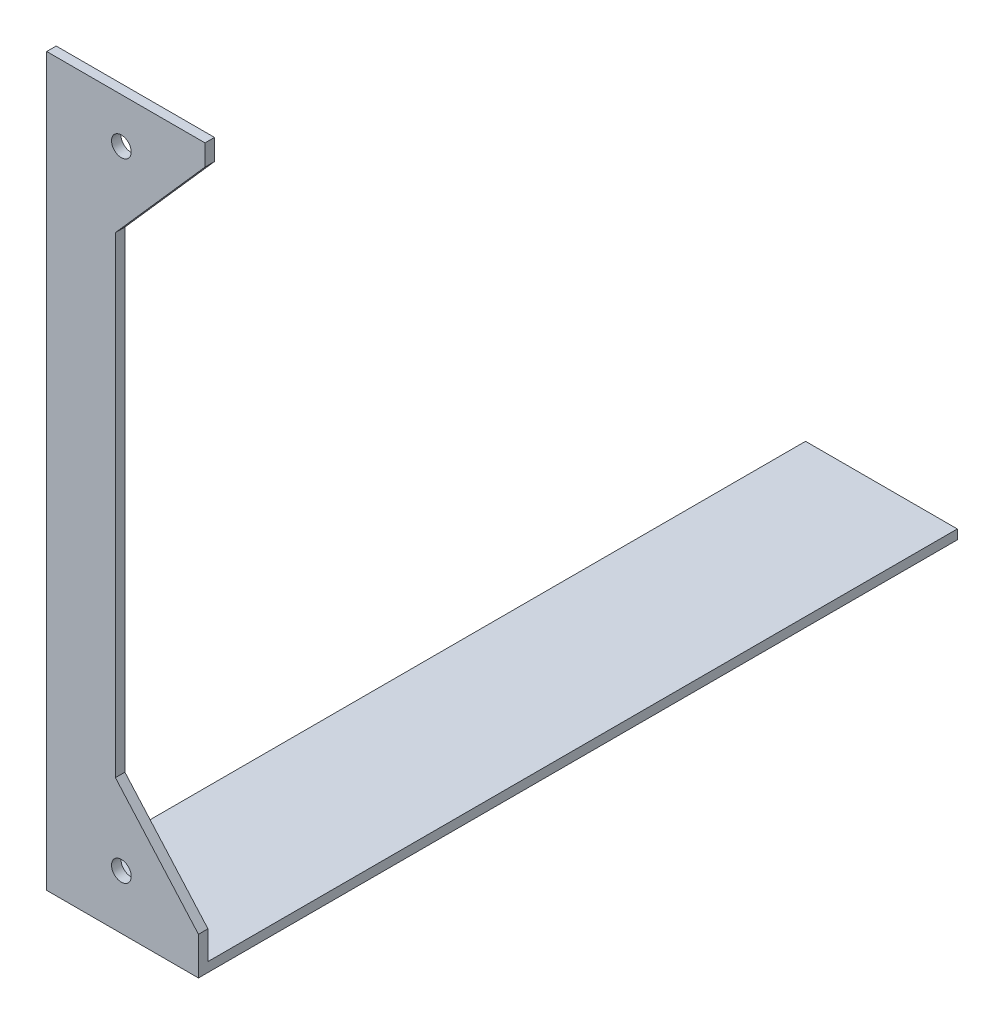
ISO-10303-21;
HEADER;
FILE_DESCRIPTION(('STEP AP214'),'2;1');
FILE_NAME('part.step','',(''),(''),'','','');
FILE_SCHEMA(('AUTOMOTIVE_DESIGN { 1 0 10303 214 1 1 1 1 }'));
ENDSEC;
DATA;
#1=APPLICATION_CONTEXT('core data for automotive mechanical design processes');
#2=APPLICATION_PROTOCOL_DEFINITION('international standard','automotive_design',2000,#1);
#3=PRODUCT_CONTEXT('',#1,'mechanical');
#4=PRODUCT('Part','Part','',(#3));
#5=PRODUCT_RELATED_PRODUCT_CATEGORY('part','',(#4));
#6=PRODUCT_DEFINITION_FORMATION('','',#4);
#7=PRODUCT_DEFINITION_CONTEXT('part definition',#1,'design');
#8=PRODUCT_DEFINITION('design','',#6,#7);
#9=PRODUCT_DEFINITION_SHAPE('','',#8);
#10=(LENGTH_UNIT() NAMED_UNIT(*) SI_UNIT(.MILLI.,.METRE.));
#11=(NAMED_UNIT(*) PLANE_ANGLE_UNIT() SI_UNIT($,.RADIAN.));
#12=(NAMED_UNIT(*) SI_UNIT($,.STERADIAN.) SOLID_ANGLE_UNIT());
#13=UNCERTAINTY_MEASURE_WITH_UNIT(LENGTH_MEASURE(1.E-05),#10,'distance_accuracy_value','');
#14=(GEOMETRIC_REPRESENTATION_CONTEXT(3) GLOBAL_UNCERTAINTY_ASSIGNED_CONTEXT((#13)) GLOBAL_UNIT_ASSIGNED_CONTEXT((#10,
#11,#12)) REPRESENTATION_CONTEXT('',''));
#15=CARTESIAN_POINT('',(0.,0.,0.));
#16=DIRECTION('',(0.,0.,1.));
#17=DIRECTION('',(1.,0.,0.));
#18=AXIS2_PLACEMENT_3D('',#15,#16,#17);
#19=CARTESIAN_POINT('',(-238.5,0.,1.5875));
#20=DIRECTION('',(-1.,0.,0.));
#21=DIRECTION('',(0.,0.,1.));
#22=AXIS2_PLACEMENT_3D('',#19,#20,#21);
#23=PLANE('',#22);
#24=DIRECTION('',(0.,1.,0.));
#25=VECTOR('',#24,1.);
#26=CARTESIAN_POINT('',(-238.5,0.,0.));
#27=LINE('',#26,#25);
#28=CARTESIAN_POINT('',(-238.5,20.5,0.));
#29=VERTEX_POINT('',#28);
#30=CARTESIAN_POINT('',(-238.5,99.5,0.));
#31=VERTEX_POINT('',#30);
#32=EDGE_CURVE('E147',#29,#31,#27,.T.);
#33=ORIENTED_EDGE('',*,*,#32,.T.);
#34=DIRECTION('',(0.,0.,-1.));
#35=VECTOR('',#34,1.);
#36=CARTESIAN_POINT('',(-238.5,99.5,1.5875));
#37=LINE('',#36,#35);
#38=CARTESIAN_POINT('',(-238.5,99.5,1.5875));
#39=VERTEX_POINT('',#38);
#40=EDGE_CURVE('E11',#39,#31,#37,.T.);
#41=ORIENTED_EDGE('',*,*,#40,.F.);
#42=DIRECTION('',(0.,1.,0.));
#43=VECTOR('',#42,1.);
#44=CARTESIAN_POINT('',(-238.5,0.,1.5875));
#45=LINE('',#44,#43);
#46=CARTESIAN_POINT('',(-238.5,20.5,1.5875));
#47=VERTEX_POINT('',#46);
#48=EDGE_CURVE('E172',#47,#39,#45,.T.);
#49=ORIENTED_EDGE('',*,*,#48,.F.);
#50=DIRECTION('',(0.,0.,-1.));
#51=VECTOR('',#50,1.);
#52=CARTESIAN_POINT('',(-238.5,20.5,1.5875));
#53=LINE('',#52,#51);
#54=EDGE_CURVE('E146',#47,#29,#53,.T.);
#55=ORIENTED_EDGE('',*,*,#54,.T.);
#56=EDGE_LOOP('',(#33,#41,#49,#55));
#57=FACE_BOUND('',#56,.T.);
#58=ADVANCED_FACE('F41',(#57),#23,.F.);
#59=CARTESIAN_POINT('',(-183.461089494164,161.877431906615,1.5875));
#60=DIRECTION('',(-0.749837855365093,0.661621637086846,0.));
#61=DIRECTION('',(-0.661621637086846,-0.749837855365093,0.));
#62=AXIS2_PLACEMENT_3D('',#59,#60,#61);
#63=PLANE('',#62);
#64=DIRECTION('',(0.661621637086846,0.749837855365093,0.));
#65=VECTOR('',#64,1.);
#66=CARTESIAN_POINT('',(-183.461089494164,161.877431906615,0.));
#67=LINE('',#66,#65);
#68=CARTESIAN_POINT('',(-223.5,116.5,0.));
#69=VERTEX_POINT('',#68);
#70=EDGE_CURVE('E150',#31,#69,#67,.T.);
#71=ORIENTED_EDGE('',*,*,#70,.T.);
#72=DIRECTION('',(0.,0.,-1.));
#73=VECTOR('',#72,1.);
#74=CARTESIAN_POINT('',(-223.5,116.5,1.5875));
#75=LINE('',#74,#73);
#76=CARTESIAN_POINT('',(-223.5,116.5,1.5875));
#77=VERTEX_POINT('',#76);
#78=EDGE_CURVE('E49',#77,#69,#75,.T.);
#79=ORIENTED_EDGE('',*,*,#78,.F.);
#80=DIRECTION('',(0.661621637086846,0.749837855365093,0.));
#81=VECTOR('',#80,1.);
#82=CARTESIAN_POINT('',(-183.461089494164,161.877431906615,1.5875));
#83=LINE('',#82,#81);
#84=EDGE_CURVE('E94',#39,#77,#83,.T.);
#85=ORIENTED_EDGE('',*,*,#84,.F.);
#86=ORIENTED_EDGE('',*,*,#40,.T.);
#87=EDGE_LOOP('',(#71,#79,#85,#86));
#88=FACE_BOUND('',#87,.T.);
#89=ADVANCED_FACE('F219',(#88),#63,.F.);
#90=CARTESIAN_POINT('',(-223.500000000002,3.54478351433893E-12,1.5875));
#91=DIRECTION('',(-1.,0.,0.));
#92=DIRECTION('',(0.,-1.,0.));
#93=AXIS2_PLACEMENT_3D('',#90,#91,#92);
#94=PLANE('',#93);
#95=DIRECTION('',(0.,1.,0.));
#96=VECTOR('',#95,1.);
#97=CARTESIAN_POINT('',(-223.500000000002,3.54478351433893E-12,0.));
#98=LINE('',#97,#96);
#99=CARTESIAN_POINT('',(-223.5,120.,0.));
#100=VERTEX_POINT('',#99);
#101=EDGE_CURVE('E153',#69,#100,#98,.T.);
#102=ORIENTED_EDGE('',*,*,#101,.T.);
#103=DIRECTION('',(0.,0.,-1.));
#104=VECTOR('',#103,1.);
#105=CARTESIAN_POINT('',(-223.5,120.,1.5875));
#106=LINE('',#105,#104);
#107=CARTESIAN_POINT('',(-223.5,120.,1.5875));
#108=VERTEX_POINT('',#107);
#109=EDGE_CURVE('E115',#108,#100,#106,.T.);
#110=ORIENTED_EDGE('',*,*,#109,.F.);
#111=DIRECTION('',(0.,1.,0.));
#112=VECTOR('',#111,1.);
#113=CARTESIAN_POINT('',(-223.500000000002,3.54478351433893E-12,1.5875));
#114=LINE('',#113,#112);
#115=EDGE_CURVE('E125',#77,#108,#114,.T.);
#116=ORIENTED_EDGE('',*,*,#115,.F.);
#117=ORIENTED_EDGE('',*,*,#78,.T.);
#118=EDGE_LOOP('',(#102,#110,#116,#117));
#119=FACE_BOUND('',#118,.T.);
#120=ADVANCED_FACE('F178',(#119),#94,.F.);
#121=CARTESIAN_POINT('',(0.,120.,1.5875));
#122=DIRECTION('',(0.,1.,0.));
#123=DIRECTION('',(0.,0.,1.));
#124=AXIS2_PLACEMENT_3D('',#121,#122,#123);
#125=PLANE('',#124);
#126=DIRECTION('',(1.,0.,0.));
#127=VECTOR('',#126,1.);
#128=CARTESIAN_POINT('',(0.,120.,0.));
#129=LINE('',#128,#127);
#130=CARTESIAN_POINT('',(-250.,120.,0.));
#131=VERTEX_POINT('',#130);
#132=EDGE_CURVE('E110',#131,#100,#129,.T.);
#133=ORIENTED_EDGE('',*,*,#132,.F.);
#134=DIRECTION('',(0.,0.,-1.));
#135=VECTOR('',#134,1.);
#136=CARTESIAN_POINT('',(-250.,120.,1.5875));
#137=LINE('',#136,#135);
#138=CARTESIAN_POINT('',(-250.,120.,1.5875));
#139=VERTEX_POINT('',#138);
#140=EDGE_CURVE('E105',#139,#131,#137,.T.);
#141=ORIENTED_EDGE('',*,*,#140,.F.);
#142=DIRECTION('',(1.,0.,0.));
#143=VECTOR('',#142,1.);
#144=CARTESIAN_POINT('',(0.,120.,1.5875));
#145=LINE('',#144,#143);
#146=EDGE_CURVE('E108',#139,#108,#145,.T.);
#147=ORIENTED_EDGE('',*,*,#146,.T.);
#148=ORIENTED_EDGE('',*,*,#109,.T.);
#149=EDGE_LOOP('',(#133,#141,#147,#148));
#150=FACE_BOUND('',#149,.T.);
#151=ADVANCED_FACE('F107',(#150),#125,.T.);
#152=CARTESIAN_POINT('',(-250.,0.,1.5875));
#153=DIRECTION('',(-1.,0.,0.));
#154=DIRECTION('',(0.,0.,1.));
#155=AXIS2_PLACEMENT_3D('',#152,#153,#154);
#156=PLANE('',#155);
#157=DIRECTION('',(0.,1.,0.));
#158=VECTOR('',#157,1.);
#159=CARTESIAN_POINT('',(-250.,0.,0.));
#160=LINE('',#159,#158);
#161=CARTESIAN_POINT('',(-250.,0.,0.));
#162=VERTEX_POINT('',#161);
#163=EDGE_CURVE('E157',#162,#131,#160,.T.);
#164=ORIENTED_EDGE('',*,*,#163,.F.);
#165=DIRECTION('',(0.,0.,-1.));
#166=VECTOR('',#165,1.);
#167=CARTESIAN_POINT('',(-250.,0.,1.5875));
#168=LINE('',#167,#166);
#169=CARTESIAN_POINT('',(-250.,0.,-125.4125));
#170=VERTEX_POINT('',#169);
#171=EDGE_CURVE('E186',#162,#170,#168,.T.);
#172=ORIENTED_EDGE('',*,*,#171,.T.);
#173=DIRECTION('',(0.,1.,0.));
#174=VECTOR('',#173,1.);
#175=CARTESIAN_POINT('',(-250.,-1.5875,-125.4125));
#176=LINE('',#175,#174);
#177=CARTESIAN_POINT('',(-250.,-1.5875,-125.4125));
#178=VERTEX_POINT('',#177);
#179=EDGE_CURVE('E189',#178,#170,#176,.T.);
#180=ORIENTED_EDGE('',*,*,#179,.F.);
#181=DIRECTION('',(0.,0.,-1.));
#182=VECTOR('',#181,1.);
#183=CARTESIAN_POINT('',(-250.,-1.5875,1.5875));
#184=LINE('',#183,#182);
#185=CARTESIAN_POINT('',(-250.,-1.5875,1.5875));
#186=VERTEX_POINT('',#185);
#187=EDGE_CURVE('E132',#186,#178,#184,.T.);
#188=ORIENTED_EDGE('',*,*,#187,.F.);
#189=DIRECTION('',(0.,1.,0.));
#190=VECTOR('',#189,1.);
#191=CARTESIAN_POINT('',(-250.,0.,1.5875));
#192=LINE('',#191,#190);
#193=EDGE_CURVE('E122',#186,#139,#192,.T.);
#194=ORIENTED_EDGE('',*,*,#193,.T.);
#195=ORIENTED_EDGE('',*,*,#140,.T.);
#196=EDGE_LOOP('',(#164,#172,#180,#188,#194,#195));
#197=FACE_BOUND('',#196,.T.);
#198=ADVANCED_FACE('F129',(#197),#156,.T.);
#199=CARTESIAN_POINT('',(-224.6,0.,1.5875));
#200=DIRECTION('',(1.,0.,0.));
#201=DIRECTION('',(0.,0.,-1.));
#202=AXIS2_PLACEMENT_3D('',#199,#200,#201);
#203=PLANE('',#202);
#204=DIRECTION('',(0.,-1.,0.));
#205=VECTOR('',#204,1.);
#206=CARTESIAN_POINT('',(-224.6,0.,0.));
#207=LINE('',#206,#205);
#208=CARTESIAN_POINT('',(-224.6,4.74666666666657,0.));
#209=VERTEX_POINT('',#208);
#210=CARTESIAN_POINT('',(-224.6,0.,0.));
#211=VERTEX_POINT('',#210);
#212=EDGE_CURVE('E162',#209,#211,#207,.T.);
#213=ORIENTED_EDGE('',*,*,#212,.F.);
#214=DIRECTION('',(0.,0.,-1.));
#215=VECTOR('',#214,1.);
#216=CARTESIAN_POINT('',(-224.6,4.74666666666657,1.5875));
#217=LINE('',#216,#215);
#218=CARTESIAN_POINT('',(-224.6,4.74666666666657,1.5875));
#219=VERTEX_POINT('',#218);
#220=EDGE_CURVE('E83',#219,#209,#217,.T.);
#221=ORIENTED_EDGE('',*,*,#220,.F.);
#222=DIRECTION('',(0.,-1.,0.));
#223=VECTOR('',#222,1.);
#224=CARTESIAN_POINT('',(-224.6,0.,1.5875));
#225=LINE('',#224,#223);
#226=CARTESIAN_POINT('',(-224.6,-1.5875,1.5875));
#227=VERTEX_POINT('',#226);
#228=EDGE_CURVE('E133',#219,#227,#225,.T.);
#229=ORIENTED_EDGE('',*,*,#228,.T.);
#230=DIRECTION('',(0.,0.,1.));
#231=VECTOR('',#230,1.);
#232=CARTESIAN_POINT('',(-224.6,-1.5875,-125.4125));
#233=LINE('',#232,#231);
#234=CARTESIAN_POINT('',(-224.6,-1.5875,-125.4125));
#235=VERTEX_POINT('',#234);
#236=EDGE_CURVE('E262',#235,#227,#233,.T.);
#237=ORIENTED_EDGE('',*,*,#236,.F.);
#238=DIRECTION('',(0.,1.,0.));
#239=VECTOR('',#238,1.);
#240=CARTESIAN_POINT('',(-224.6,-1.5875,-125.4125));
#241=LINE('',#240,#239);
#242=CARTESIAN_POINT('',(-224.6,0.,-125.4125));
#243=VERTEX_POINT('',#242);
#244=EDGE_CURVE('E151',#235,#243,#241,.T.);
#245=ORIENTED_EDGE('',*,*,#244,.T.);
#246=DIRECTION('',(0.,0.,1.));
#247=VECTOR('',#246,1.);
#248=CARTESIAN_POINT('',(-224.6,0.,-125.4125));
#249=LINE('',#248,#247);
#250=EDGE_CURVE('E196',#243,#211,#249,.T.);
#251=ORIENTED_EDGE('',*,*,#250,.T.);
#252=EDGE_LOOP('',(#213,#221,#229,#237,#245,#251));
#253=FACE_BOUND('',#252,.T.);
#254=ADVANCED_FACE('F231',(#253),#203,.T.);
#255=CARTESIAN_POINT('',(-237.5,7.5,1.5875));
#256=DIRECTION('',(0.,0.,-1.));
#257=DIRECTION('',(-1.,0.,0.));
#258=AXIS2_PLACEMENT_3D('',#255,#256,#257);
#259=CYLINDRICAL_SURFACE('',#258,1.65);
#260=CARTESIAN_POINT('',(-237.5,7.5,1.5875));
#261=DIRECTION('',(0.,0.,1.));
#262=DIRECTION('',(1.,0.,0.));
#263=AXIS2_PLACEMENT_3D('',#260,#261,#262);
#264=CIRCLE('',#263,1.65);
#265=CARTESIAN_POINT('',(-235.85,7.5,1.5875));
#266=VERTEX_POINT('',#265);
#267=EDGE_CURVE('E140',#266,#266,#264,.T.);
#268=ORIENTED_EDGE('',*,*,#267,.T.);
#269=EDGE_LOOP('',(#268));
#270=FACE_BOUND('',#269,.T.);
#271=CARTESIAN_POINT('',(-237.5,7.5,0.));
#272=DIRECTION('',(0.,0.,1.));
#273=DIRECTION('',(1.,0.,0.));
#274=AXIS2_PLACEMENT_3D('',#271,#272,#273);
#275=CIRCLE('',#274,1.65);
#276=CARTESIAN_POINT('',(-235.85,7.5,0.));
#277=VERTEX_POINT('',#276);
#278=EDGE_CURVE('E166',#277,#277,#275,.T.);
#279=ORIENTED_EDGE('',*,*,#278,.F.);
#280=EDGE_LOOP('',(#279));
#281=FACE_BOUND('',#280,.T.);
#282=ADVANCED_FACE('F234',(#270,#281),#259,.F.);
#283=CARTESIAN_POINT('',(-123.928015564202,-109.348249027237,1.5875));
#284=DIRECTION('',(-0.749837855365093,-0.661621637086846,0.));
#285=DIRECTION('',(0.661621637086846,-0.749837855365093,0.));
#286=AXIS2_PLACEMENT_3D('',#283,#284,#285);
#287=PLANE('',#286);
#288=DIRECTION('',(-0.661621637086846,0.749837855365093,0.));
#289=VECTOR('',#288,1.);
#290=CARTESIAN_POINT('',(-123.928015564202,-109.348249027237,0.));
#291=LINE('',#290,#289);
#292=EDGE_CURVE('E86',#209,#29,#291,.T.);
#293=ORIENTED_EDGE('',*,*,#292,.T.);
#294=ORIENTED_EDGE('',*,*,#54,.F.);
#295=DIRECTION('',(-0.661621637086846,0.749837855365093,0.));
#296=VECTOR('',#295,1.);
#297=CARTESIAN_POINT('',(-123.928015564202,-109.348249027237,1.5875));
#298=LINE('',#297,#296);
#299=EDGE_CURVE('E57',#219,#47,#298,.T.);
#300=ORIENTED_EDGE('',*,*,#299,.F.);
#301=ORIENTED_EDGE('',*,*,#220,.T.);
#302=EDGE_LOOP('',(#293,#294,#300,#301));
#303=FACE_BOUND('',#302,.T.);
#304=ADVANCED_FACE('F236',(#303),#287,.F.);
#305=CARTESIAN_POINT('',(-237.5,112.5,1.5875));
#306=DIRECTION('',(0.,0.,-1.));
#307=DIRECTION('',(-1.,0.,0.));
#308=AXIS2_PLACEMENT_3D('',#305,#306,#307);
#309=CYLINDRICAL_SURFACE('',#308,1.65);
#310=CARTESIAN_POINT('',(-237.5,112.5,1.5875));
#311=DIRECTION('',(0.,0.,1.));
#312=DIRECTION('',(1.,0.,0.));
#313=AXIS2_PLACEMENT_3D('',#310,#311,#312);
#314=CIRCLE('',#313,1.65);
#315=CARTESIAN_POINT('',(-235.85,112.5,1.5875));
#316=VERTEX_POINT('',#315);
#317=EDGE_CURVE('E143',#316,#316,#314,.T.);
#318=ORIENTED_EDGE('',*,*,#317,.T.);
#319=EDGE_LOOP('',(#318));
#320=FACE_BOUND('',#319,.T.);
#321=CARTESIAN_POINT('',(-237.5,112.5,0.));
#322=DIRECTION('',(0.,0.,1.));
#323=DIRECTION('',(1.,0.,0.));
#324=AXIS2_PLACEMENT_3D('',#321,#322,#323);
#325=CIRCLE('',#324,1.65);
#326=CARTESIAN_POINT('',(-235.85,112.5,0.));
#327=VERTEX_POINT('',#326);
#328=EDGE_CURVE('E169',#327,#327,#325,.T.);
#329=ORIENTED_EDGE('',*,*,#328,.F.);
#330=EDGE_LOOP('',(#329));
#331=FACE_BOUND('',#330,.T.);
#332=ADVANCED_FACE('F239',(#320,#331),#309,.F.);
#333=CARTESIAN_POINT('',(0.,0.,1.5875));
#334=DIRECTION('',(0.,0.,1.));
#335=DIRECTION('',(1.,0.,0.));
#336=AXIS2_PLACEMENT_3D('',#333,#334,#335);
#337=PLANE('',#336);
#338=ORIENTED_EDGE('',*,*,#48,.T.);
#339=ORIENTED_EDGE('',*,*,#84,.T.);
#340=ORIENTED_EDGE('',*,*,#115,.T.);
#341=ORIENTED_EDGE('',*,*,#146,.F.);
#342=ORIENTED_EDGE('',*,*,#193,.F.);
#343=DIRECTION('',(-1.,0.,0.));
#344=VECTOR('',#343,1.);
#345=CARTESIAN_POINT('',(-224.6,-1.5875,1.5875));
#346=LINE('',#345,#344);
#347=EDGE_CURVE('E270',#227,#186,#346,.T.);
#348=ORIENTED_EDGE('',*,*,#347,.F.);
#349=ORIENTED_EDGE('',*,*,#228,.F.);
#350=ORIENTED_EDGE('',*,*,#299,.T.);
#351=EDGE_LOOP('',(#338,#339,#340,#341,#342,#348,#349,#350));
#352=FACE_BOUND('',#351,.T.);
#353=ORIENTED_EDGE('',*,*,#267,.F.);
#354=EDGE_LOOP('',(#353));
#355=FACE_BOUND('',#354,.T.);
#356=ORIENTED_EDGE('',*,*,#317,.F.);
#357=EDGE_LOOP('',(#356));
#358=FACE_BOUND('',#357,.T.);
#359=ADVANCED_FACE('F118',(#352,#355,#358),#337,.T.);
#360=CARTESIAN_POINT('',(0.,0.,0.));
#361=DIRECTION('',(0.,0.,1.));
#362=DIRECTION('',(1.,0.,0.));
#363=AXIS2_PLACEMENT_3D('',#360,#361,#362);
#364=PLANE('',#363);
#365=ORIENTED_EDGE('',*,*,#32,.F.);
#366=ORIENTED_EDGE('',*,*,#292,.F.);
#367=ORIENTED_EDGE('',*,*,#212,.T.);
#368=DIRECTION('',(-1.,0.,0.));
#369=VECTOR('',#368,1.);
#370=CARTESIAN_POINT('',(0.,0.,0.));
#371=LINE('',#370,#369);
#372=EDGE_CURVE('E159',#211,#162,#371,.T.);
#373=ORIENTED_EDGE('',*,*,#372,.T.);
#374=ORIENTED_EDGE('',*,*,#163,.T.);
#375=ORIENTED_EDGE('',*,*,#132,.T.);
#376=ORIENTED_EDGE('',*,*,#101,.F.);
#377=ORIENTED_EDGE('',*,*,#70,.F.);
#378=EDGE_LOOP('',(#365,#366,#367,#373,#374,#375,#376,#377));
#379=FACE_BOUND('',#378,.T.);
#380=ORIENTED_EDGE('',*,*,#278,.T.);
#381=EDGE_LOOP('',(#380));
#382=FACE_BOUND('',#381,.T.);
#383=ORIENTED_EDGE('',*,*,#328,.T.);
#384=EDGE_LOOP('',(#383));
#385=FACE_BOUND('',#384,.T.);
#386=ADVANCED_FACE('F181',(#379,#382,#385),#364,.F.);
#387=CARTESIAN_POINT('',(-250.,-1.5875,-125.4125));
#388=DIRECTION('',(0.,0.,1.));
#389=DIRECTION('',(1.,0.,0.));
#390=AXIS2_PLACEMENT_3D('',#387,#388,#389);
#391=PLANE('',#390);
#392=DIRECTION('',(1.,0.,0.));
#393=VECTOR('',#392,1.);
#394=CARTESIAN_POINT('',(-250.,0.,-125.4125));
#395=LINE('',#394,#393);
#396=EDGE_CURVE('E202',#170,#243,#395,.T.);
#397=ORIENTED_EDGE('',*,*,#396,.T.);
#398=ORIENTED_EDGE('',*,*,#244,.F.);
#399=DIRECTION('',(1.,0.,0.));
#400=VECTOR('',#399,1.);
#401=CARTESIAN_POINT('',(-250.,-1.5875,-125.4125));
#402=LINE('',#401,#400);
#403=EDGE_CURVE('E195',#178,#235,#402,.T.);
#404=ORIENTED_EDGE('',*,*,#403,.F.);
#405=ORIENTED_EDGE('',*,*,#179,.T.);
#406=EDGE_LOOP('',(#397,#398,#404,#405));
#407=FACE_BOUND('',#406,.T.);
#408=ADVANCED_FACE('F200',(#407),#391,.F.);
#409=CARTESIAN_POINT('',(0.,-1.5875,0.));
#410=DIRECTION('',(0.,-1.,0.));
#411=DIRECTION('',(0.,0.,-1.));
#412=AXIS2_PLACEMENT_3D('',#409,#410,#411);
#413=PLANE('',#412);
#414=ORIENTED_EDGE('',*,*,#403,.T.);
#415=ORIENTED_EDGE('',*,*,#236,.T.);
#416=ORIENTED_EDGE('',*,*,#347,.T.);
#417=ORIENTED_EDGE('',*,*,#187,.T.);
#418=EDGE_LOOP('',(#414,#415,#416,#417));
#419=FACE_BOUND('',#418,.T.);
#420=ADVANCED_FACE('F252',(#419),#413,.T.);
#421=CARTESIAN_POINT('',(0.,0.,0.));
#422=DIRECTION('',(0.,-1.,0.));
#423=DIRECTION('',(0.,0.,-1.));
#424=AXIS2_PLACEMENT_3D('',#421,#422,#423);
#425=PLANE('',#424);
#426=ORIENTED_EDGE('',*,*,#372,.F.);
#427=ORIENTED_EDGE('',*,*,#250,.F.);
#428=ORIENTED_EDGE('',*,*,#396,.F.);
#429=ORIENTED_EDGE('',*,*,#171,.F.);
#430=EDGE_LOOP('',(#426,#427,#428,#429));
#431=FACE_BOUND('',#430,.T.);
#432=ADVANCED_FACE('F206',(#431),#425,.F.);
#433=CLOSED_SHELL('',(#58,#89,#120,#151,#198,#254,#282,#304,#332,#359,#386,#408,#420,#432));
#434=MANIFOLD_SOLID_BREP('B2',#433);
#435=ADVANCED_BREP_SHAPE_REPRESENTATION('',(#18,#434),#14);
#436=SHAPE_DEFINITION_REPRESENTATION(#9,#435);
ENDSEC;
END-ISO-10303-21;
